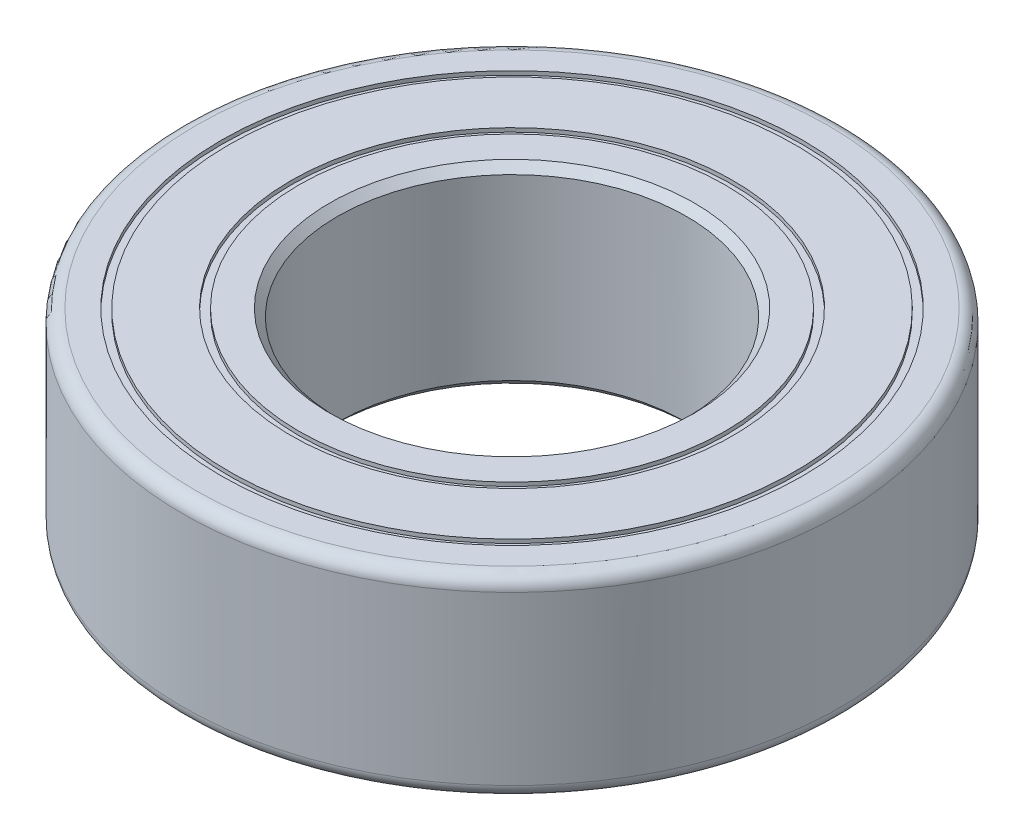
ISO-10303-21;
HEADER;
FILE_DESCRIPTION(('STEP AP214'),'2;1');
FILE_NAME('part.step','',(''),(''),'','','');
FILE_SCHEMA(('AUTOMOTIVE_DESIGN { 1 0 10303 214 1 1 1 1 }'));
ENDSEC;
DATA;
#1=APPLICATION_CONTEXT('core data for automotive mechanical design processes');
#2=APPLICATION_PROTOCOL_DEFINITION('international standard','automotive_design',2000,#1);
#3=PRODUCT_CONTEXT('',#1,'mechanical');
#4=PRODUCT('Part','Part','',(#3));
#5=PRODUCT_RELATED_PRODUCT_CATEGORY('part','',(#4));
#6=PRODUCT_DEFINITION_FORMATION('','',#4);
#7=PRODUCT_DEFINITION_CONTEXT('part definition',#1,'design');
#8=PRODUCT_DEFINITION('design','',#6,#7);
#9=PRODUCT_DEFINITION_SHAPE('','',#8);
#10=(LENGTH_UNIT() NAMED_UNIT(*) SI_UNIT(.MILLI.,.METRE.));
#11=(NAMED_UNIT(*) PLANE_ANGLE_UNIT() SI_UNIT($,.RADIAN.));
#12=(NAMED_UNIT(*) SI_UNIT($,.STERADIAN.) SOLID_ANGLE_UNIT());
#13=UNCERTAINTY_MEASURE_WITH_UNIT(LENGTH_MEASURE(1.E-05),#10,'distance_accuracy_value','');
#14=(GEOMETRIC_REPRESENTATION_CONTEXT(3) GLOBAL_UNCERTAINTY_ASSIGNED_CONTEXT((#13)) GLOBAL_UNIT_ASSIGNED_CONTEXT((#10,
#11,#12)) REPRESENTATION_CONTEXT('',''));
#15=CARTESIAN_POINT('',(0.,0.,0.));
#16=DIRECTION('',(0.,0.,1.));
#17=DIRECTION('',(1.,0.,0.));
#18=AXIS2_PLACEMENT_3D('',#15,#16,#17);
#19=CARTESIAN_POINT('',(8.5,0.,0.));
#20=DIRECTION('',(0.,1.,0.));
#21=DIRECTION('',(-1.,0.,0.));
#22=AXIS2_PLACEMENT_3D('',#19,#20,#21);
#23=PLANE('',#22);
#24=CARTESIAN_POINT('',(0.,0.,0.));
#25=DIRECTION('',(0.,1.,0.));
#26=DIRECTION('',(-1.,0.,0.));
#27=AXIS2_PLACEMENT_3D('',#24,#25,#26);
#28=CIRCLE('',#27,8.156);
#29=CARTESIAN_POINT('',(-8.156,0.,0.));
#30=VERTEX_POINT('',#29);
#31=EDGE_CURVE('E81',#30,#30,#28,.F.);
#32=ORIENTED_EDGE('',*,*,#31,.T.);
#33=EDGE_LOOP('',(#32));
#34=FACE_BOUND('',#33,.T.);
#35=CARTESIAN_POINT('',(0.,0.,0.));
#36=DIRECTION('',(0.,1.,0.));
#37=DIRECTION('',(-1.,0.,0.));
#38=AXIS2_PLACEMENT_3D('',#35,#36,#37);
#39=CIRCLE('',#38,7.5);
#40=CARTESIAN_POINT('',(-7.5,0.,0.));
#41=VERTEX_POINT('',#40);
#42=EDGE_CURVE('E93',#41,#41,#39,.T.);
#43=ORIENTED_EDGE('',*,*,#42,.T.);
#44=EDGE_LOOP('',(#43));
#45=FACE_BOUND('',#44,.T.);
#46=ADVANCED_FACE('F51',(#34,#45),#23,.F.);
#47=CARTESIAN_POINT('',(0.,2.5,0.));
#48=DIRECTION('',(0.,1.,0.));
#49=DIRECTION('',(-1.,0.,0.));
#50=AXIS2_PLACEMENT_3D('',#47,#48,#49);
#51=CYLINDRICAL_SURFACE('',#50,7.5);
#52=ORIENTED_EDGE('',*,*,#42,.F.);
#53=EDGE_LOOP('',(#52));
#54=FACE_BOUND('',#53,.T.);
#55=CARTESIAN_POINT('',(0.,0.0999999999999998,0.));
#56=DIRECTION('',(0.,1.,0.));
#57=DIRECTION('',(-1.,0.,0.));
#58=AXIS2_PLACEMENT_3D('',#55,#56,#57);
#59=CIRCLE('',#58,7.5);
#60=CARTESIAN_POINT('',(-7.5,0.0999999999999998,0.));
#61=VERTEX_POINT('',#60);
#62=EDGE_CURVE('E97',#61,#61,#59,.T.);
#63=ORIENTED_EDGE('',*,*,#62,.T.);
#64=EDGE_LOOP('',(#63));
#65=FACE_BOUND('',#64,.T.);
#66=ADVANCED_FACE('F175',(#54,#65),#51,.F.);
#67=CARTESIAN_POINT('',(7.5,0.1,0.));
#68=DIRECTION('',(0.,1.,0.));
#69=DIRECTION('',(-1.,0.,0.));
#70=AXIS2_PLACEMENT_3D('',#67,#68,#69);
#71=PLANE('',#70);
#72=ORIENTED_EDGE('',*,*,#62,.F.);
#73=EDGE_LOOP('',(#72));
#74=FACE_BOUND('',#73,.T.);
#75=CARTESIAN_POINT('',(0.,0.0999999999999998,0.));
#76=DIRECTION('',(0.,1.,0.));
#77=DIRECTION('',(-1.,0.,0.));
#78=AXIS2_PLACEMENT_3D('',#75,#76,#77);
#79=CIRCLE('',#78,7.3);
#80=CARTESIAN_POINT('',(-7.3,0.0999999999999998,0.));
#81=VERTEX_POINT('',#80);
#82=EDGE_CURVE('E101',#81,#81,#79,.T.);
#83=ORIENTED_EDGE('',*,*,#82,.T.);
#84=EDGE_LOOP('',(#83));
#85=FACE_BOUND('',#84,.T.);
#86=ADVANCED_FACE('F182',(#74,#85),#71,.F.);
#87=CARTESIAN_POINT('',(0.,2.5,0.));
#88=DIRECTION('',(0.,1.,0.));
#89=DIRECTION('',(-1.,0.,0.));
#90=AXIS2_PLACEMENT_3D('',#87,#88,#89);
#91=CYLINDRICAL_SURFACE('',#90,7.3);
#92=ORIENTED_EDGE('',*,*,#82,.F.);
#93=EDGE_LOOP('',(#92));
#94=FACE_BOUND('',#93,.T.);
#95=CARTESIAN_POINT('',(0.,0.,0.));
#96=DIRECTION('',(0.,1.,0.));
#97=DIRECTION('',(-1.,0.,0.));
#98=AXIS2_PLACEMENT_3D('',#95,#96,#97);
#99=CIRCLE('',#98,7.3);
#100=CARTESIAN_POINT('',(-7.3,0.,0.));
#101=VERTEX_POINT('',#100);
#102=EDGE_CURVE('E105',#101,#101,#99,.T.);
#103=ORIENTED_EDGE('',*,*,#102,.T.);
#104=EDGE_LOOP('',(#103));
#105=FACE_BOUND('',#104,.T.);
#106=ADVANCED_FACE('F235',(#94,#105),#91,.T.);
#107=CARTESIAN_POINT('',(5.7,0.,0.));
#108=DIRECTION('',(0.,1.,0.));
#109=DIRECTION('',(-1.,0.,0.));
#110=AXIS2_PLACEMENT_3D('',#107,#108,#109);
#111=PLANE('',#110);
#112=ORIENTED_EDGE('',*,*,#102,.F.);
#113=EDGE_LOOP('',(#112));
#114=FACE_BOUND('',#113,.T.);
#115=CARTESIAN_POINT('',(0.,0.,0.));
#116=DIRECTION('',(0.,1.,0.));
#117=DIRECTION('',(-1.,0.,0.));
#118=AXIS2_PLACEMENT_3D('',#115,#116,#117);
#119=CIRCLE('',#118,5.7);
#120=CARTESIAN_POINT('',(-5.7,0.,0.));
#121=VERTEX_POINT('',#120);
#122=EDGE_CURVE('E109',#121,#121,#119,.T.);
#123=ORIENTED_EDGE('',*,*,#122,.T.);
#124=EDGE_LOOP('',(#123));
#125=FACE_BOUND('',#124,.T.);
#126=ADVANCED_FACE('F231',(#114,#125),#111,.F.);
#127=CARTESIAN_POINT('',(0.,2.5,0.));
#128=DIRECTION('',(0.,1.,0.));
#129=DIRECTION('',(-1.,0.,0.));
#130=AXIS2_PLACEMENT_3D('',#127,#128,#129);
#131=CYLINDRICAL_SURFACE('',#130,5.7);
#132=ORIENTED_EDGE('',*,*,#122,.F.);
#133=EDGE_LOOP('',(#132));
#134=FACE_BOUND('',#133,.T.);
#135=CARTESIAN_POINT('',(0.,0.0999999999999998,0.));
#136=DIRECTION('',(0.,1.,0.));
#137=DIRECTION('',(-1.,0.,0.));
#138=AXIS2_PLACEMENT_3D('',#135,#136,#137);
#139=CIRCLE('',#138,5.7);
#140=CARTESIAN_POINT('',(-5.7,0.0999999999999998,0.));
#141=VERTEX_POINT('',#140);
#142=EDGE_CURVE('E113',#141,#141,#139,.T.);
#143=ORIENTED_EDGE('',*,*,#142,.T.);
#144=EDGE_LOOP('',(#143));
#145=FACE_BOUND('',#144,.T.);
#146=ADVANCED_FACE('F223',(#134,#145),#131,.F.);
#147=CARTESIAN_POINT('',(5.5,0.1,0.));
#148=DIRECTION('',(0.,1.,0.));
#149=DIRECTION('',(-1.,0.,0.));
#150=AXIS2_PLACEMENT_3D('',#147,#148,#149);
#151=PLANE('',#150);
#152=ORIENTED_EDGE('',*,*,#142,.F.);
#153=EDGE_LOOP('',(#152));
#154=FACE_BOUND('',#153,.T.);
#155=CARTESIAN_POINT('',(0.,0.0999999999999998,0.));
#156=DIRECTION('',(0.,1.,0.));
#157=DIRECTION('',(-1.,0.,0.));
#158=AXIS2_PLACEMENT_3D('',#155,#156,#157);
#159=CIRCLE('',#158,5.5);
#160=CARTESIAN_POINT('',(-5.5,0.0999999999999998,0.));
#161=VERTEX_POINT('',#160);
#162=EDGE_CURVE('E117',#161,#161,#159,.T.);
#163=ORIENTED_EDGE('',*,*,#162,.T.);
#164=EDGE_LOOP('',(#163));
#165=FACE_BOUND('',#164,.T.);
#166=ADVANCED_FACE('F216',(#154,#165),#151,.F.);
#167=CARTESIAN_POINT('',(0.,2.5,0.));
#168=DIRECTION('',(0.,1.,0.));
#169=DIRECTION('',(-1.,0.,0.));
#170=AXIS2_PLACEMENT_3D('',#167,#168,#169);
#171=CYLINDRICAL_SURFACE('',#170,5.5);
#172=ORIENTED_EDGE('',*,*,#162,.F.);
#173=EDGE_LOOP('',(#172));
#174=FACE_BOUND('',#173,.T.);
#175=CARTESIAN_POINT('',(0.,0.,0.));
#176=DIRECTION('',(0.,1.,0.));
#177=DIRECTION('',(-1.,0.,0.));
#178=AXIS2_PLACEMENT_3D('',#175,#176,#177);
#179=CIRCLE('',#178,5.5);
#180=CARTESIAN_POINT('',(-5.5,0.,0.));
#181=VERTEX_POINT('',#180);
#182=EDGE_CURVE('E121',#181,#181,#179,.T.);
#183=ORIENTED_EDGE('',*,*,#182,.T.);
#184=EDGE_LOOP('',(#183));
#185=FACE_BOUND('',#184,.T.);
#186=ADVANCED_FACE('F211',(#174,#185),#171,.T.);
#187=CARTESIAN_POINT('',(4.5,0.,0.));
#188=DIRECTION('',(0.,1.,0.));
#189=DIRECTION('',(-1.,0.,0.));
#190=AXIS2_PLACEMENT_3D('',#187,#188,#189);
#191=PLANE('',#190);
#192=CARTESIAN_POINT('',(0.,0.,0.));
#193=DIRECTION('',(0.,1.,0.));
#194=DIRECTION('',(-1.,0.,0.));
#195=AXIS2_PLACEMENT_3D('',#192,#193,#194);
#196=CIRCLE('',#195,4.7);
#197=CARTESIAN_POINT('',(-4.7,0.,0.));
#198=VERTEX_POINT('',#197);
#199=EDGE_CURVE('E72',#198,#198,#196,.T.);
#200=ORIENTED_EDGE('',*,*,#199,.T.);
#201=EDGE_LOOP('',(#200));
#202=FACE_BOUND('',#201,.T.);
#203=ORIENTED_EDGE('',*,*,#182,.F.);
#204=EDGE_LOOP('',(#203));
#205=FACE_BOUND('',#204,.T.);
#206=ADVANCED_FACE('F208',(#202,#205),#191,.F.);
#207=CARTESIAN_POINT('',(0.,2.5,0.));
#208=DIRECTION('',(0.,1.,0.));
#209=DIRECTION('',(-1.,0.,0.));
#210=AXIS2_PLACEMENT_3D('',#207,#208,#209);
#211=CYLINDRICAL_SURFACE('',#210,4.5);
#212=CARTESIAN_POINT('',(0.,0.200000000000001,0.));
#213=DIRECTION('',(0.,1.,0.));
#214=DIRECTION('',(-1.,0.,0.));
#215=AXIS2_PLACEMENT_3D('',#212,#213,#214);
#216=CIRCLE('',#215,4.5);
#217=CARTESIAN_POINT('',(-4.5,0.200000000000001,0.));
#218=VERTEX_POINT('',#217);
#219=EDGE_CURVE('E60',#218,#218,#216,.F.);
#220=ORIENTED_EDGE('',*,*,#219,.T.);
#221=EDGE_LOOP('',(#220));
#222=FACE_BOUND('',#221,.T.);
#223=CARTESIAN_POINT('',(0.,4.8,0.));
#224=DIRECTION('',(0.,-1.,0.));
#225=DIRECTION('',(1.,0.,0.));
#226=AXIS2_PLACEMENT_3D('',#223,#224,#225);
#227=CIRCLE('',#226,4.5);
#228=CARTESIAN_POINT('',(4.5,4.8,0.));
#229=VERTEX_POINT('',#228);
#230=EDGE_CURVE('E66',#229,#229,#227,.F.);
#231=ORIENTED_EDGE('',*,*,#230,.T.);
#232=EDGE_LOOP('',(#231));
#233=FACE_BOUND('',#232,.T.);
#234=ADVANCED_FACE('F210',(#222,#233),#211,.F.);
#235=CARTESIAN_POINT('',(4.5,5.,0.));
#236=DIRECTION('',(0.,-1.,0.));
#237=DIRECTION('',(1.,0.,0.));
#238=AXIS2_PLACEMENT_3D('',#235,#236,#237);
#239=PLANE('',#238);
#240=CARTESIAN_POINT('',(0.,5.,0.));
#241=DIRECTION('',(0.,-1.,0.));
#242=DIRECTION('',(1.,0.,0.));
#243=AXIS2_PLACEMENT_3D('',#240,#241,#242);
#244=CIRCLE('',#243,4.7);
#245=CARTESIAN_POINT('',(4.7,5.,0.));
#246=VERTEX_POINT('',#245);
#247=EDGE_CURVE('E10',#246,#246,#244,.T.);
#248=ORIENTED_EDGE('',*,*,#247,.T.);
#249=EDGE_LOOP('',(#248));
#250=FACE_BOUND('',#249,.T.);
#251=CARTESIAN_POINT('',(0.,5.,0.));
#252=DIRECTION('',(0.,1.,0.));
#253=DIRECTION('',(-1.,0.,0.));
#254=AXIS2_PLACEMENT_3D('',#251,#252,#253);
#255=CIRCLE('',#254,5.5);
#256=CARTESIAN_POINT('',(-5.5,5.,0.));
#257=VERTEX_POINT('',#256);
#258=EDGE_CURVE('E125',#257,#257,#255,.T.);
#259=ORIENTED_EDGE('',*,*,#258,.T.);
#260=EDGE_LOOP('',(#259));
#261=FACE_BOUND('',#260,.T.);
#262=ADVANCED_FACE('F347',(#250,#261),#239,.F.);
#263=CARTESIAN_POINT('',(0.,2.5,0.));
#264=DIRECTION('',(0.,1.,0.));
#265=DIRECTION('',(-1.,0.,0.));
#266=AXIS2_PLACEMENT_3D('',#263,#264,#265);
#267=CYLINDRICAL_SURFACE('',#266,5.5);
#268=ORIENTED_EDGE('',*,*,#258,.F.);
#269=EDGE_LOOP('',(#268));
#270=FACE_BOUND('',#269,.T.);
#271=CARTESIAN_POINT('',(0.,4.9,0.));
#272=DIRECTION('',(0.,1.,0.));
#273=DIRECTION('',(-1.,0.,0.));
#274=AXIS2_PLACEMENT_3D('',#271,#272,#273);
#275=CIRCLE('',#274,5.5);
#276=CARTESIAN_POINT('',(-5.5,4.9,0.));
#277=VERTEX_POINT('',#276);
#278=EDGE_CURVE('E129',#277,#277,#275,.T.);
#279=ORIENTED_EDGE('',*,*,#278,.T.);
#280=EDGE_LOOP('',(#279));
#281=FACE_BOUND('',#280,.T.);
#282=ADVANCED_FACE('F339',(#270,#281),#267,.T.);
#283=CARTESIAN_POINT('',(5.5,4.9,0.));
#284=DIRECTION('',(0.,-1.,0.));
#285=DIRECTION('',(1.,0.,0.));
#286=AXIS2_PLACEMENT_3D('',#283,#284,#285);
#287=PLANE('',#286);
#288=ORIENTED_EDGE('',*,*,#278,.F.);
#289=EDGE_LOOP('',(#288));
#290=FACE_BOUND('',#289,.T.);
#291=CARTESIAN_POINT('',(0.,4.9,0.));
#292=DIRECTION('',(0.,1.,0.));
#293=DIRECTION('',(-1.,0.,0.));
#294=AXIS2_PLACEMENT_3D('',#291,#292,#293);
#295=CIRCLE('',#294,5.7);
#296=CARTESIAN_POINT('',(-5.7,4.9,0.));
#297=VERTEX_POINT('',#296);
#298=EDGE_CURVE('E132',#297,#297,#295,.T.);
#299=ORIENTED_EDGE('',*,*,#298,.T.);
#300=EDGE_LOOP('',(#299));
#301=FACE_BOUND('',#300,.T.);
#302=ADVANCED_FACE('F330',(#290,#301),#287,.F.);
#303=CARTESIAN_POINT('',(0.,2.5,0.));
#304=DIRECTION('',(0.,1.,0.));
#305=DIRECTION('',(-1.,0.,0.));
#306=AXIS2_PLACEMENT_3D('',#303,#304,#305);
#307=CYLINDRICAL_SURFACE('',#306,5.7);
#308=ORIENTED_EDGE('',*,*,#298,.F.);
#309=EDGE_LOOP('',(#308));
#310=FACE_BOUND('',#309,.T.);
#311=CARTESIAN_POINT('',(0.,5.,0.));
#312=DIRECTION('',(0.,1.,0.));
#313=DIRECTION('',(-1.,0.,0.));
#314=AXIS2_PLACEMENT_3D('',#311,#312,#313);
#315=CIRCLE('',#314,5.7);
#316=CARTESIAN_POINT('',(-5.7,5.,0.));
#317=VERTEX_POINT('',#316);
#318=EDGE_CURVE('E136',#317,#317,#315,.T.);
#319=ORIENTED_EDGE('',*,*,#318,.T.);
#320=EDGE_LOOP('',(#319));
#321=FACE_BOUND('',#320,.T.);
#322=ADVANCED_FACE('F320',(#310,#321),#307,.F.);
#323=CARTESIAN_POINT('',(5.7,5.,0.));
#324=DIRECTION('',(0.,-1.,0.));
#325=DIRECTION('',(1.,0.,0.));
#326=AXIS2_PLACEMENT_3D('',#323,#324,#325);
#327=PLANE('',#326);
#328=ORIENTED_EDGE('',*,*,#318,.F.);
#329=EDGE_LOOP('',(#328));
#330=FACE_BOUND('',#329,.T.);
#331=CARTESIAN_POINT('',(0.,5.,0.));
#332=DIRECTION('',(0.,1.,0.));
#333=DIRECTION('',(-1.,0.,0.));
#334=AXIS2_PLACEMENT_3D('',#331,#332,#333);
#335=CIRCLE('',#334,7.3);
#336=CARTESIAN_POINT('',(-7.3,5.,0.));
#337=VERTEX_POINT('',#336);
#338=EDGE_CURVE('E140',#337,#337,#335,.T.);
#339=ORIENTED_EDGE('',*,*,#338,.T.);
#340=EDGE_LOOP('',(#339));
#341=FACE_BOUND('',#340,.T.);
#342=ADVANCED_FACE('F311',(#330,#341),#327,.F.);
#343=CARTESIAN_POINT('',(0.,2.5,0.));
#344=DIRECTION('',(0.,1.,0.));
#345=DIRECTION('',(-1.,0.,0.));
#346=AXIS2_PLACEMENT_3D('',#343,#344,#345);
#347=CYLINDRICAL_SURFACE('',#346,7.3);
#348=ORIENTED_EDGE('',*,*,#338,.F.);
#349=EDGE_LOOP('',(#348));
#350=FACE_BOUND('',#349,.T.);
#351=CARTESIAN_POINT('',(0.,4.9,0.));
#352=DIRECTION('',(0.,1.,0.));
#353=DIRECTION('',(-1.,0.,0.));
#354=AXIS2_PLACEMENT_3D('',#351,#352,#353);
#355=CIRCLE('',#354,7.3);
#356=CARTESIAN_POINT('',(-7.3,4.9,0.));
#357=VERTEX_POINT('',#356);
#358=EDGE_CURVE('E144',#357,#357,#355,.T.);
#359=ORIENTED_EDGE('',*,*,#358,.T.);
#360=EDGE_LOOP('',(#359));
#361=FACE_BOUND('',#360,.T.);
#362=ADVANCED_FACE('F302',(#350,#361),#347,.T.);
#363=CARTESIAN_POINT('',(7.5,4.9,0.));
#364=DIRECTION('',(0.,-1.,0.));
#365=DIRECTION('',(1.,0.,0.));
#366=AXIS2_PLACEMENT_3D('',#363,#364,#365);
#367=PLANE('',#366);
#368=ORIENTED_EDGE('',*,*,#358,.F.);
#369=EDGE_LOOP('',(#368));
#370=FACE_BOUND('',#369,.T.);
#371=CARTESIAN_POINT('',(0.,4.9,0.));
#372=DIRECTION('',(0.,1.,0.));
#373=DIRECTION('',(-1.,0.,0.));
#374=AXIS2_PLACEMENT_3D('',#371,#372,#373);
#375=CIRCLE('',#374,7.5);
#376=CARTESIAN_POINT('',(-7.5,4.9,0.));
#377=VERTEX_POINT('',#376);
#378=EDGE_CURVE('E148',#377,#377,#375,.T.);
#379=ORIENTED_EDGE('',*,*,#378,.T.);
#380=EDGE_LOOP('',(#379));
#381=FACE_BOUND('',#380,.T.);
#382=ADVANCED_FACE('F171',(#370,#381),#367,.F.);
#383=CARTESIAN_POINT('',(0.,2.5,0.));
#384=DIRECTION('',(0.,1.,0.));
#385=DIRECTION('',(-1.,0.,0.));
#386=AXIS2_PLACEMENT_3D('',#383,#384,#385);
#387=CYLINDRICAL_SURFACE('',#386,7.5);
#388=ORIENTED_EDGE('',*,*,#378,.F.);
#389=EDGE_LOOP('',(#388));
#390=FACE_BOUND('',#389,.T.);
#391=CARTESIAN_POINT('',(0.,5.,0.));
#392=DIRECTION('',(0.,1.,0.));
#393=DIRECTION('',(-1.,0.,0.));
#394=AXIS2_PLACEMENT_3D('',#391,#392,#393);
#395=CIRCLE('',#394,7.5);
#396=CARTESIAN_POINT('',(-7.5,5.,0.));
#397=VERTEX_POINT('',#396);
#398=EDGE_CURVE('E152',#397,#397,#395,.T.);
#399=ORIENTED_EDGE('',*,*,#398,.T.);
#400=EDGE_LOOP('',(#399));
#401=FACE_BOUND('',#400,.T.);
#402=ADVANCED_FACE('F157',(#390,#401),#387,.F.);
#403=CARTESIAN_POINT('',(8.5,5.,0.));
#404=DIRECTION('',(0.,-1.,0.));
#405=DIRECTION('',(1.,0.,0.));
#406=AXIS2_PLACEMENT_3D('',#403,#404,#405);
#407=PLANE('',#406);
#408=CARTESIAN_POINT('',(0.,5.,0.));
#409=DIRECTION('',(0.,-1.,0.));
#410=DIRECTION('',(1.,0.,0.));
#411=AXIS2_PLACEMENT_3D('',#408,#409,#410);
#412=CIRCLE('',#411,8.156);
#413=CARTESIAN_POINT('',(8.156,5.,0.));
#414=VERTEX_POINT('',#413);
#415=EDGE_CURVE('E77',#414,#414,#412,.F.);
#416=ORIENTED_EDGE('',*,*,#415,.T.);
#417=EDGE_LOOP('',(#416));
#418=FACE_BOUND('',#417,.T.);
#419=ORIENTED_EDGE('',*,*,#398,.F.);
#420=EDGE_LOOP('',(#419));
#421=FACE_BOUND('',#420,.T.);
#422=ADVANCED_FACE('F159',(#418,#421),#407,.F.);
#423=CARTESIAN_POINT('',(0.,2.5,0.));
#424=DIRECTION('',(0.,1.,0.));
#425=DIRECTION('',(-1.,0.,0.));
#426=AXIS2_PLACEMENT_3D('',#423,#424,#425);
#427=CYLINDRICAL_SURFACE('',#426,8.5);
#428=CARTESIAN_POINT('',(0.,0.344,0.));
#429=DIRECTION('',(0.,1.,0.));
#430=DIRECTION('',(-1.,0.,0.));
#431=AXIS2_PLACEMENT_3D('',#428,#429,#430);
#432=CIRCLE('',#431,8.5);
#433=CARTESIAN_POINT('',(-8.5,0.344,0.));
#434=VERTEX_POINT('',#433);
#435=EDGE_CURVE('E85',#434,#434,#432,.T.);
#436=ORIENTED_EDGE('',*,*,#435,.T.);
#437=EDGE_LOOP('',(#436));
#438=FACE_BOUND('',#437,.T.);
#439=CARTESIAN_POINT('',(0.,4.656,0.));
#440=DIRECTION('',(0.,-1.,0.));
#441=DIRECTION('',(1.,0.,0.));
#442=AXIS2_PLACEMENT_3D('',#439,#440,#441);
#443=CIRCLE('',#442,8.5);
#444=CARTESIAN_POINT('',(8.5,4.656,0.));
#445=VERTEX_POINT('',#444);
#446=EDGE_CURVE('E89',#445,#445,#443,.T.);
#447=ORIENTED_EDGE('',*,*,#446,.T.);
#448=EDGE_LOOP('',(#447));
#449=FACE_BOUND('',#448,.T.);
#450=ADVANCED_FACE('F161',(#438,#449),#427,.T.);
#451=CARTESIAN_POINT('',(0.,0.344,0.));
#452=DIRECTION('',(0.,1.,0.));
#453=DIRECTION('',(-1.,0.,0.));
#454=AXIS2_PLACEMENT_3D('',#451,#452,#453);
#455=TOROIDAL_SURFACE('',#454,8.156,0.344);
#456=ORIENTED_EDGE('',*,*,#31,.F.);
#457=EDGE_LOOP('',(#456));
#458=FACE_BOUND('',#457,.T.);
#459=ORIENTED_EDGE('',*,*,#435,.F.);
#460=EDGE_LOOP('',(#459));
#461=FACE_BOUND('',#460,.T.);
#462=ADVANCED_FACE('F167',(#458,#461),#455,.T.);
#463=CARTESIAN_POINT('',(0.,4.656,0.));
#464=DIRECTION('',(0.,-1.,0.));
#465=DIRECTION('',(1.,0.,0.));
#466=AXIS2_PLACEMENT_3D('',#463,#464,#465);
#467=TOROIDAL_SURFACE('',#466,8.156,0.344);
#468=ORIENTED_EDGE('',*,*,#446,.F.);
#469=EDGE_LOOP('',(#468));
#470=FACE_BOUND('',#469,.T.);
#471=ORIENTED_EDGE('',*,*,#415,.F.);
#472=EDGE_LOOP('',(#471));
#473=FACE_BOUND('',#472,.T.);
#474=ADVANCED_FACE('F190',(#470,#473),#467,.T.);
#475=CARTESIAN_POINT('',(0.,0.,0.));
#476=DIRECTION('',(0.,-1.,0.));
#477=DIRECTION('',(1.,0.,0.));
#478=AXIS2_PLACEMENT_3D('',#475,#476,#477);
#479=CONICAL_SURFACE('',#478,4.7,0.785398163397448);
#480=ORIENTED_EDGE('',*,*,#219,.F.);
#481=EDGE_LOOP('',(#480));
#482=FACE_BOUND('',#481,.T.);
#483=ORIENTED_EDGE('',*,*,#199,.F.);
#484=EDGE_LOOP('',(#483));
#485=FACE_BOUND('',#484,.T.);
#486=ADVANCED_FACE('F193',(#482,#485),#479,.F.);
#487=CARTESIAN_POINT('',(0.,4.8,0.));
#488=DIRECTION('',(0.,1.,0.));
#489=DIRECTION('',(-1.,0.,0.));
#490=AXIS2_PLACEMENT_3D('',#487,#488,#489);
#491=CONICAL_SURFACE('',#490,4.5,0.785398163397448);
#492=ORIENTED_EDGE('',*,*,#247,.F.);
#493=EDGE_LOOP('',(#492));
#494=FACE_BOUND('',#493,.T.);
#495=ORIENTED_EDGE('',*,*,#230,.F.);
#496=EDGE_LOOP('',(#495));
#497=FACE_BOUND('',#496,.T.);
#498=ADVANCED_FACE('F54',(#494,#497),#491,.F.);
#499=CLOSED_SHELL('',(#46,#66,#86,#106,#126,#146,#166,#186,#206,#234,#262,#282,#302,#322,#342,
#362,#382,#402,#422,#450,#462,#474,#486,#498));
#500=MANIFOLD_SOLID_BREP('B2',#499);
#501=ADVANCED_BREP_SHAPE_REPRESENTATION('',(#18,#500),#14);
#502=SHAPE_DEFINITION_REPRESENTATION(#9,#501);
ENDSEC;
END-ISO-10303-21;
